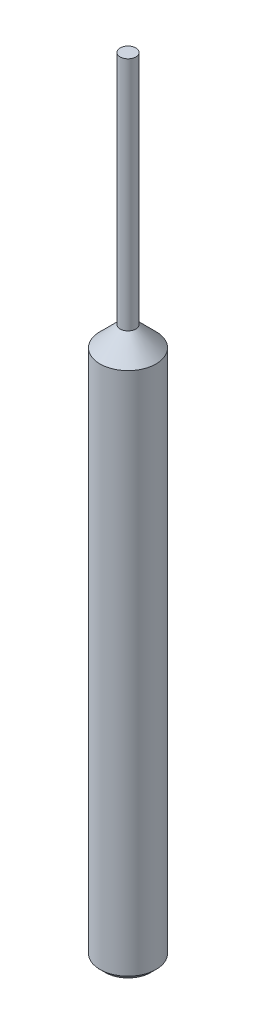
ISO-10303-21;
HEADER;
FILE_DESCRIPTION(('STEP AP214'),'2;1');
FILE_NAME('part.step','',(''),(''),'','','');
FILE_SCHEMA(('AUTOMOTIVE_DESIGN { 1 0 10303 214 1 1 1 1 }'));
ENDSEC;
DATA;
#1=APPLICATION_CONTEXT('core data for automotive mechanical design processes');
#2=APPLICATION_PROTOCOL_DEFINITION('international standard','automotive_design',2000,#1);
#3=PRODUCT_CONTEXT('',#1,'mechanical');
#4=PRODUCT('Part','Part','',(#3));
#5=PRODUCT_RELATED_PRODUCT_CATEGORY('part','',(#4));
#6=PRODUCT_DEFINITION_FORMATION('','',#4);
#7=PRODUCT_DEFINITION_CONTEXT('part definition',#1,'design');
#8=PRODUCT_DEFINITION('design','',#6,#7);
#9=PRODUCT_DEFINITION_SHAPE('','',#8);
#10=(LENGTH_UNIT() NAMED_UNIT(*) SI_UNIT(.MILLI.,.METRE.));
#11=(NAMED_UNIT(*) PLANE_ANGLE_UNIT() SI_UNIT($,.RADIAN.));
#12=(NAMED_UNIT(*) SI_UNIT($,.STERADIAN.) SOLID_ANGLE_UNIT());
#13=UNCERTAINTY_MEASURE_WITH_UNIT(LENGTH_MEASURE(1.E-05),#10,'distance_accuracy_value','');
#14=(GEOMETRIC_REPRESENTATION_CONTEXT(3) GLOBAL_UNCERTAINTY_ASSIGNED_CONTEXT((#13)) GLOBAL_UNIT_ASSIGNED_CONTEXT((#10,
#11,#12)) REPRESENTATION_CONTEXT('',''));
#15=CARTESIAN_POINT('',(0.,0.,0.));
#16=DIRECTION('',(0.,0.,1.));
#17=DIRECTION('',(1.,0.,0.));
#18=AXIS2_PLACEMENT_3D('',#15,#16,#17);
#19=CARTESIAN_POINT('',(0.,0.,0.));
#20=DIRECTION('',(0.,-1.,0.));
#21=DIRECTION('',(0.,0.,-1.));
#22=AXIS2_PLACEMENT_3D('',#19,#20,#21);
#23=PLANE('',#22);
#24=CARTESIAN_POINT('',(0.,0.,0.));
#25=DIRECTION('',(0.,-1.,0.));
#26=DIRECTION('',(0.,0.,-1.));
#27=AXIS2_PLACEMENT_3D('',#24,#25,#26);
#28=CIRCLE('',#27,4.35);
#29=CARTESIAN_POINT('',(0.,0.,-4.35));
#30=VERTEX_POINT('',#29);
#31=EDGE_CURVE('E10',#30,#30,#28,.T.);
#32=ORIENTED_EDGE('',*,*,#31,.T.);
#33=EDGE_LOOP('',(#32));
#34=FACE_BOUND('',#33,.T.);
#35=ADVANCED_FACE('F34',(#34),#23,.T.);
#36=CARTESIAN_POINT('',(0.,0.,0.));
#37=DIRECTION('',(0.,1.,0.));
#38=DIRECTION('',(0.,0.,1.));
#39=AXIS2_PLACEMENT_3D('',#36,#37,#38);
#40=CONICAL_SURFACE('',#39,4.35,0.785398163397451);
#41=CARTESIAN_POINT('',(0.,0.999999999999994,0.));
#42=DIRECTION('',(0.,-1.,0.));
#43=DIRECTION('',(0.,0.,-1.));
#44=AXIS2_PLACEMENT_3D('',#41,#42,#43);
#45=CIRCLE('',#44,5.35);
#46=CARTESIAN_POINT('',(0.,0.999999999999994,-5.35));
#47=VERTEX_POINT('',#46);
#48=EDGE_CURVE('E40',#47,#47,#45,.T.);
#49=ORIENTED_EDGE('',*,*,#48,.T.);
#50=EDGE_LOOP('',(#49));
#51=FACE_BOUND('',#50,.T.);
#52=ORIENTED_EDGE('',*,*,#31,.F.);
#53=EDGE_LOOP('',(#52));
#54=FACE_BOUND('',#53,.T.);
#55=ADVANCED_FACE('F69',(#51,#54),#40,.T.);
#56=CARTESIAN_POINT('',(0.,-34.7937306283384,0.));
#57=DIRECTION('',(0.,-1.,0.));
#58=DIRECTION('',(0.,0.,-1.));
#59=AXIS2_PLACEMENT_3D('',#56,#57,#58);
#60=CYLINDRICAL_SURFACE('',#59,5.35);
#61=CARTESIAN_POINT('',(0.,101.15,0.));
#62=DIRECTION('',(0.,-1.,0.));
#63=DIRECTION('',(0.,0.,-1.));
#64=AXIS2_PLACEMENT_3D('',#61,#62,#63);
#65=CIRCLE('',#64,5.35);
#66=CARTESIAN_POINT('',(0.,101.15,-5.34999999999999));
#67=VERTEX_POINT('',#66);
#68=EDGE_CURVE('E44',#67,#67,#65,.T.);
#69=ORIENTED_EDGE('',*,*,#68,.T.);
#70=EDGE_LOOP('',(#69));
#71=FACE_BOUND('',#70,.T.);
#72=ORIENTED_EDGE('',*,*,#48,.F.);
#73=EDGE_LOOP('',(#72));
#74=FACE_BOUND('',#73,.T.);
#75=ADVANCED_FACE('F73',(#71,#74),#60,.T.);
#76=CARTESIAN_POINT('',(0.,101.15,0.));
#77=DIRECTION('',(0.,-1.,0.));
#78=DIRECTION('',(0.,0.,-1.));
#79=AXIS2_PLACEMENT_3D('',#76,#77,#78);
#80=CONICAL_SURFACE('',#79,5.35,0.785398163397446);
#81=CARTESIAN_POINT('',(0.,105.,0.));
#82=DIRECTION('',(0.,-1.,0.));
#83=DIRECTION('',(0.,0.,-1.));
#84=AXIS2_PLACEMENT_3D('',#81,#82,#83);
#85=CIRCLE('',#84,1.5);
#86=CARTESIAN_POINT('',(0.,105.,-1.49999999999999));
#87=VERTEX_POINT('',#86);
#88=EDGE_CURVE('E48',#87,#87,#85,.T.);
#89=CARTESIAN_POINT('',(0.,105.,-1.49999999999999));
#90=CARTESIAN_POINT('',(0.,104.959895833333,-1.54010416666666));
#91=CARTESIAN_POINT('',(0.,104.919791666667,-1.58020833333333));
#92=CARTESIAN_POINT('',(0.,104.839583333333,-1.66041666666666));
#93=CARTESIAN_POINT('',(0.,104.799479166667,-1.70052083333333));
#94=CARTESIAN_POINT('',(0.,104.719270833333,-1.78072916666666));
#95=CARTESIAN_POINT('',(0.,104.679166666667,-1.82083333333333));
#96=CARTESIAN_POINT('',(0.,104.598958333333,-1.90104166666666));
#97=CARTESIAN_POINT('',(0.,104.558854166667,-1.94114583333333));
#98=CARTESIAN_POINT('',(0.,104.478645833333,-2.02135416666666));
#99=CARTESIAN_POINT('',(0.,104.438541666667,-2.06145833333333));
#100=CARTESIAN_POINT('',(0.,104.358333333333,-2.14166666666666));
#101=CARTESIAN_POINT('',(0.,104.318229166667,-2.18177083333333));
#102=CARTESIAN_POINT('',(0.,104.238020833333,-2.26197916666666));
#103=CARTESIAN_POINT('',(0.,104.197916666667,-2.30208333333333));
#104=CARTESIAN_POINT('',(0.,104.117708333333,-2.38229166666666));
#105=CARTESIAN_POINT('',(0.,104.077604166667,-2.42239583333333));
#106=CARTESIAN_POINT('',(0.,103.997395833333,-2.50260416666666));
#107=CARTESIAN_POINT('',(0.,103.957291666667,-2.54270833333333));
#108=CARTESIAN_POINT('',(0.,103.877083333333,-2.62291666666666));
#109=CARTESIAN_POINT('',(0.,103.836979166667,-2.66302083333333));
#110=CARTESIAN_POINT('',(0.,103.756770833333,-2.74322916666666));
#111=CARTESIAN_POINT('',(0.,103.716666666667,-2.78333333333333));
#112=CARTESIAN_POINT('',(0.,103.636458333333,-2.86354166666666));
#113=CARTESIAN_POINT('',(0.,103.596354166667,-2.90364583333333));
#114=CARTESIAN_POINT('',(0.,103.516145833333,-2.98385416666666));
#115=CARTESIAN_POINT('',(0.,103.476041666667,-3.02395833333333));
#116=CARTESIAN_POINT('',(0.,103.395833333333,-3.10416666666666));
#117=CARTESIAN_POINT('',(0.,103.355729166667,-3.14427083333333));
#118=CARTESIAN_POINT('',(0.,103.275520833333,-3.22447916666666));
#119=CARTESIAN_POINT('',(0.,103.235416666667,-3.26458333333333));
#120=CARTESIAN_POINT('',(0.,103.155208333333,-3.34479166666666));
#121=CARTESIAN_POINT('',(0.,103.115104166667,-3.38489583333333));
#122=CARTESIAN_POINT('',(0.,103.034895833333,-3.46510416666666));
#123=CARTESIAN_POINT('',(0.,102.994791666667,-3.50520833333333));
#124=CARTESIAN_POINT('',(0.,102.914583333333,-3.58541666666666));
#125=CARTESIAN_POINT('',(0.,102.874479166667,-3.62552083333333));
#126=CARTESIAN_POINT('',(0.,102.794270833333,-3.70572916666666));
#127=CARTESIAN_POINT('',(0.,102.754166666667,-3.74583333333333));
#128=CARTESIAN_POINT('',(0.,102.673958333333,-3.82604166666666));
#129=CARTESIAN_POINT('',(0.,102.633854166667,-3.86614583333333));
#130=CARTESIAN_POINT('',(0.,102.553645833333,-3.94635416666666));
#131=CARTESIAN_POINT('',(0.,102.513541666667,-3.98645833333333));
#132=CARTESIAN_POINT('',(0.,102.433333333333,-4.06666666666666));
#133=CARTESIAN_POINT('',(0.,102.393229166667,-4.10677083333333));
#134=CARTESIAN_POINT('',(0.,102.313020833333,-4.18697916666666));
#135=CARTESIAN_POINT('',(0.,102.272916666667,-4.22708333333333));
#136=CARTESIAN_POINT('',(0.,102.192708333333,-4.30729166666666));
#137=CARTESIAN_POINT('',(0.,102.152604166667,-4.34739583333333));
#138=CARTESIAN_POINT('',(0.,102.072395833333,-4.42760416666666));
#139=CARTESIAN_POINT('',(0.,102.032291666667,-4.46770833333333));
#140=CARTESIAN_POINT('',(0.,101.952083333333,-4.54791666666666));
#141=CARTESIAN_POINT('',(0.,101.911979166667,-4.58802083333333));
#142=CARTESIAN_POINT('',(0.,101.831770833333,-4.66822916666666));
#143=CARTESIAN_POINT('',(0.,101.791666666667,-4.70833333333333));
#144=CARTESIAN_POINT('',(0.,101.711458333333,-4.78854166666666));
#145=CARTESIAN_POINT('',(0.,101.671354166667,-4.82864583333333));
#146=CARTESIAN_POINT('',(0.,101.591145833333,-4.90885416666666));
#147=CARTESIAN_POINT('',(0.,101.551041666667,-4.94895833333333));
#148=CARTESIAN_POINT('',(0.,101.470833333333,-5.02916666666666));
#149=CARTESIAN_POINT('',(0.,101.430729166667,-5.06927083333333));
#150=CARTESIAN_POINT('',(0.,101.350520833333,-5.14947916666666));
#151=CARTESIAN_POINT('',(0.,101.310416666667,-5.18958333333333));
#152=CARTESIAN_POINT('',(0.,101.230208333333,-5.26979166666666));
#153=CARTESIAN_POINT('',(0.,101.190104166667,-5.30989583333333));
#154=CARTESIAN_POINT('',(0.,101.15,-5.34999999999999));
#155=B_SPLINE_CURVE_WITH_KNOTS('',3,(#89,#90,#91,#92,#93,#94,#95,#96,#97,#98,#99,#100,#101,#102,
#103,#104,#105,#106,#107,#108,#109,#110,#111,#112,#113,#114,#115,#116,#117,#118,#119,#120,#121,
#122,#123,#124,#125,#126,#127,#128,#129,#130,#131,#132,#133,#134,#135,#136,#137,#138,#139,#140,
#141,#142,#143,#144,#145,#146,#147,#148,#149,#150,#151,#152,#153,#154),.UNSPECIFIED.,.F.,.F.,(4,
2,2,2,2,2,2,2,2,2,2,2,2,2,2,2,2,2,2,2,2,2,2,2,2,2,2,2,2,2,2,2,4),(0.,0.170147569223021,
0.340295138446032,0.510442707669043,0.680590276892064,0.850737846115075,1.02088541533809,
1.1910329845611,1.36118055378411,1.53132812300713,1.70147569223014,1.87162326145315,
2.04177083067617,2.21191839989918,2.38206596912219,2.5522135383452,2.72236110756822,
2.89250867679124,3.06265624601425,3.23280381523726,3.40295138446028,3.57309895368329,
3.7432465229063,3.91339409212931,4.08354166135232,4.25368923057534,4.42383679979835,
4.59398436902137,4.76413193824439,4.9342795074674,5.10442707669041,5.27457464591342,
5.44472221513643),.UNSPECIFIED.);
#156=EDGE_CURVE('BSEAM66',#87,#67,#155,.T.);
#157=ORIENTED_EDGE('',*,*,#88,.T.);
#158=ORIENTED_EDGE('',*,*,#68,.F.);
#159=ORIENTED_EDGE('',*,*,#156,.T.);
#160=ORIENTED_EDGE('',*,*,#156,.F.);
#161=EDGE_LOOP('',(#157,#159,#158,#160));
#162=FACE_BOUND('',#161,.T.);
#163=ADVANCED_FACE('F66',(#162),#80,.T.);
#164=CARTESIAN_POINT('',(0.,-34.7937306283384,0.));
#165=DIRECTION('',(0.,-1.,0.));
#166=DIRECTION('',(0.,0.,-1.));
#167=AXIS2_PLACEMENT_3D('',#164,#165,#166);
#168=CYLINDRICAL_SURFACE('',#167,1.5);
#169=CARTESIAN_POINT('',(0.,150.,0.));
#170=DIRECTION('',(0.,-1.,0.));
#171=DIRECTION('',(0.,0.,-1.));
#172=AXIS2_PLACEMENT_3D('',#169,#170,#171);
#173=CIRCLE('',#172,1.5);
#174=CARTESIAN_POINT('',(0.,150.,-1.5));
#175=VERTEX_POINT('',#174);
#176=EDGE_CURVE('E53',#175,#175,#173,.T.);
#177=ORIENTED_EDGE('',*,*,#176,.T.);
#178=EDGE_LOOP('',(#177));
#179=FACE_BOUND('',#178,.T.);
#180=ORIENTED_EDGE('',*,*,#88,.F.);
#181=EDGE_LOOP('',(#180));
#182=FACE_BOUND('',#181,.T.);
#183=ADVANCED_FACE('F57',(#179,#182),#168,.T.);
#184=CARTESIAN_POINT('',(1.5,150.,0.));
#185=DIRECTION('',(0.,1.,0.));
#186=DIRECTION('',(0.,0.,1.));
#187=AXIS2_PLACEMENT_3D('',#184,#185,#186);
#188=PLANE('',#187);
#189=ORIENTED_EDGE('',*,*,#176,.F.);
#190=EDGE_LOOP('',(#189));
#191=FACE_BOUND('',#190,.T.);
#192=ADVANCED_FACE('F60',(#191),#188,.T.);
#193=CLOSED_SHELL('',(#35,#55,#75,#163,#183,#192));
#194=MANIFOLD_SOLID_BREP('B2',#193);
#195=ADVANCED_BREP_SHAPE_REPRESENTATION('',(#18,#194),#14);
#196=SHAPE_DEFINITION_REPRESENTATION(#9,#195);
ENDSEC;
END-ISO-10303-21;
